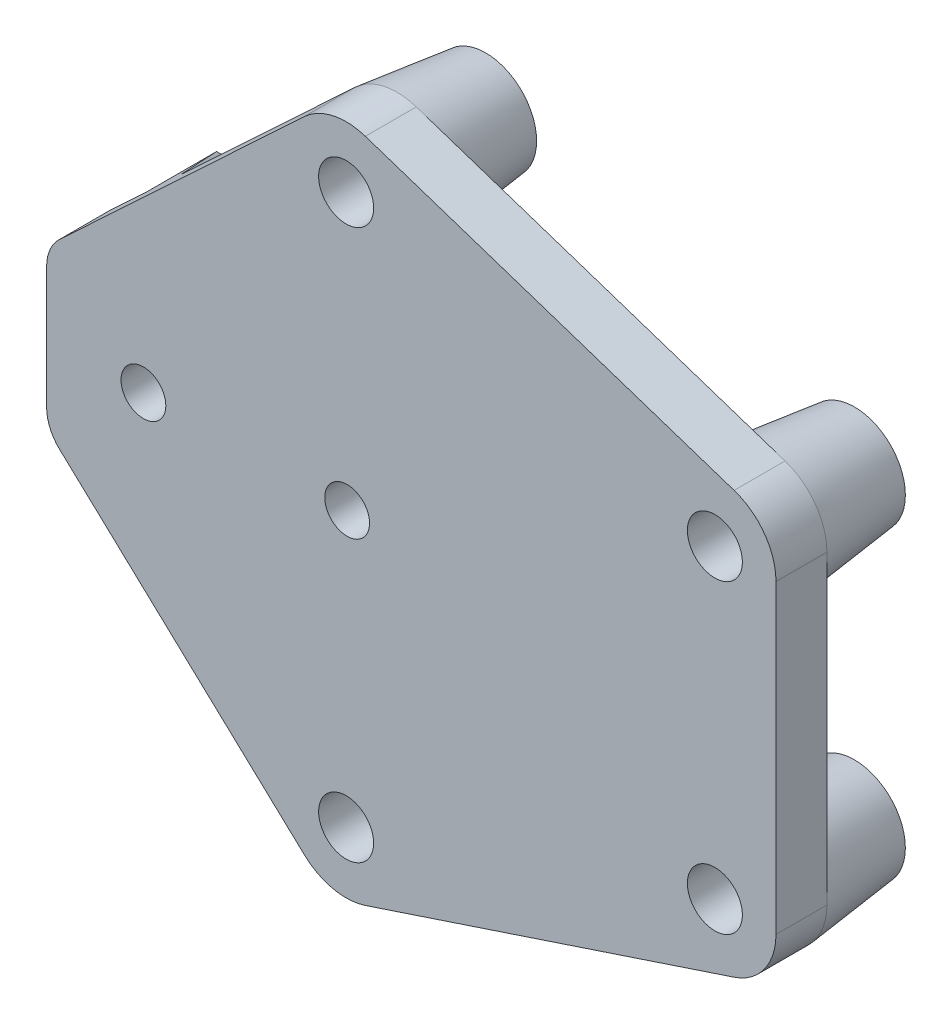
ISO-10303-21;
HEADER;
FILE_DESCRIPTION(('STEP AP214'),'2;1');
FILE_NAME('part.step','',(''),(''),'','','');
FILE_SCHEMA(('AUTOMOTIVE_DESIGN { 1 0 10303 214 1 1 1 1 }'));
ENDSEC;
DATA;
#1=APPLICATION_CONTEXT('core data for automotive mechanical design processes');
#2=APPLICATION_PROTOCOL_DEFINITION('international standard','automotive_design',2000,#1);
#3=PRODUCT_CONTEXT('',#1,'mechanical');
#4=PRODUCT('Part','Part','',(#3));
#5=PRODUCT_RELATED_PRODUCT_CATEGORY('part','',(#4));
#6=PRODUCT_DEFINITION_FORMATION('','',#4);
#7=PRODUCT_DEFINITION_CONTEXT('part definition',#1,'design');
#8=PRODUCT_DEFINITION('design','',#6,#7);
#9=PRODUCT_DEFINITION_SHAPE('','',#8);
#10=(LENGTH_UNIT() NAMED_UNIT(*) SI_UNIT(.MILLI.,.METRE.));
#11=(NAMED_UNIT(*) PLANE_ANGLE_UNIT() SI_UNIT($,.RADIAN.));
#12=(NAMED_UNIT(*) SI_UNIT($,.STERADIAN.) SOLID_ANGLE_UNIT());
#13=UNCERTAINTY_MEASURE_WITH_UNIT(LENGTH_MEASURE(1.E-05),#10,'distance_accuracy_value','');
#14=(GEOMETRIC_REPRESENTATION_CONTEXT(3) GLOBAL_UNCERTAINTY_ASSIGNED_CONTEXT((#13)) GLOBAL_UNIT_ASSIGNED_CONTEXT((#10,
#11,#12)) REPRESENTATION_CONTEXT('',''));
#15=CARTESIAN_POINT('',(0.,0.,0.));
#16=DIRECTION('',(0.,0.,1.));
#17=DIRECTION('',(1.,0.,0.));
#18=AXIS2_PLACEMENT_3D('',#15,#16,#17);
#19=CARTESIAN_POINT('',(0.,0.,0.));
#20=DIRECTION('',(0.,0.,1.));
#21=DIRECTION('',(1.,0.,0.));
#22=AXIS2_PLACEMENT_3D('',#19,#20,#21);
#23=PLANE('',#22);
#24=CARTESIAN_POINT('',(-38.,0.,0.));
#25=DIRECTION('',(0.,0.,1.));
#26=DIRECTION('',(1.,0.,0.));
#27=AXIS2_PLACEMENT_3D('',#24,#25,#26);
#28=CIRCLE('',#27,2.2);
#29=CARTESIAN_POINT('',(-35.8,0.,0.));
#30=VERTEX_POINT('',#29);
#31=EDGE_CURVE('E269',#30,#30,#28,.T.);
#32=ORIENTED_EDGE('',*,*,#31,.T.);
#33=EDGE_LOOP('',(#32));
#34=FACE_BOUND('',#33,.T.);
#35=CARTESIAN_POINT('',(-18.,0.,0.));
#36=DIRECTION('',(0.,0.,1.));
#37=DIRECTION('',(1.,0.,0.));
#38=AXIS2_PLACEMENT_3D('',#35,#36,#37);
#39=CIRCLE('',#38,2.2);
#40=CARTESIAN_POINT('',(-15.8,0.,0.));
#41=VERTEX_POINT('',#40);
#42=EDGE_CURVE('E343',#41,#41,#39,.T.);
#43=ORIENTED_EDGE('',*,*,#42,.T.);
#44=EDGE_LOOP('',(#43));
#45=FACE_BOUND('',#44,.T.);
#46=DIRECTION('',(-0.730613804474262,0.68279094070707,0.));
#47=VECTOR('',#46,1.);
#48=CARTESIAN_POINT('',(-26.0041535728882,-27.8254915836262,0.));
#49=LINE('',#48,#47);
#50=CARTESIAN_POINT('',(-22.1967456442424,-31.3836828268456,0.));
#51=VERTEX_POINT('',#50);
#52=CARTESIAN_POINT('',(-39.4069340042553,-15.3,0.));
#53=VERTEX_POINT('',#52);
#54=EDGE_CURVE('E318',#51,#53,#49,.T.);
#55=ORIENTED_EDGE('',*,*,#54,.T.);
#56=DIRECTION('',(1.,0.,0.));
#57=VECTOR('',#56,1.);
#58=CARTESIAN_POINT('',(-13.,-15.3,0.));
#59=LINE('',#58,#57);
#60=CARTESIAN_POINT('',(-13.,-15.3,0.));
#61=VERTEX_POINT('',#60);
#62=EDGE_CURVE('E182',#53,#61,#59,.T.);
#63=ORIENTED_EDGE('',*,*,#62,.T.);
#64=DIRECTION('',(0.,1.,0.));
#65=VECTOR('',#64,1.);
#66=CARTESIAN_POINT('',(-13.,0.,0.));
#67=LINE('',#66,#65);
#68=CARTESIAN_POINT('',(-13.,-10.3,0.));
#69=VERTEX_POINT('',#68);
#70=EDGE_CURVE('E51',#61,#69,#67,.T.);
#71=ORIENTED_EDGE('',*,*,#70,.T.);
#72=DIRECTION('',(1.,0.,0.));
#73=VECTOR('',#72,1.);
#74=CARTESIAN_POINT('',(0.,-10.3,0.));
#75=LINE('',#74,#73);
#76=CARTESIAN_POINT('',(-42.6170548227199,-10.3,0.));
#77=VERTEX_POINT('',#76);
#78=EDGE_CURVE('E208',#77,#69,#75,.T.);
#79=ORIENTED_EDGE('',*,*,#78,.F.);
#80=DIRECTION('',(0.,1.,0.));
#81=VECTOR('',#80,1.);
#82=CARTESIAN_POINT('',(-42.6170548227199,0.,0.));
#83=LINE('',#82,#81);
#84=CARTESIAN_POINT('',(-42.6170548227199,-12.3,0.));
#85=VERTEX_POINT('',#84);
#86=EDGE_CURVE('E211',#85,#77,#83,.T.);
#87=ORIENTED_EDGE('',*,*,#86,.F.);
#88=CARTESIAN_POINT('',(-46.2311637628283,-8.92245521789705,0.));
#89=VERTEX_POINT('',#88);
#90=EDGE_CURVE('E190',#85,#89,#49,.T.);
#91=ORIENTED_EDGE('',*,*,#90,.T.);
#92=CARTESIAN_POINT('',(-43.5,-6.,0.));
#93=DIRECTION('',(0.,0.,1.));
#94=DIRECTION('',(1.,0.,0.));
#95=AXIS2_PLACEMENT_3D('',#92,#93,#94);
#96=CIRCLE('',#95,4.);
#97=CARTESIAN_POINT('',(-47.5,-6.,0.));
#98=VERTEX_POINT('',#97);
#99=EDGE_CURVE('E265',#98,#89,#96,.T.);
#100=ORIENTED_EDGE('',*,*,#99,.F.);
#101=DIRECTION('',(0.,-1.,0.));
#102=VECTOR('',#101,1.);
#103=CARTESIAN_POINT('',(-47.5,0.,0.));
#104=LINE('',#103,#102);
#105=CARTESIAN_POINT('',(-47.5,6.,0.));
#106=VERTEX_POINT('',#105);
#107=EDGE_CURVE('E341',#106,#98,#104,.T.);
#108=ORIENTED_EDGE('',*,*,#107,.F.);
#109=CARTESIAN_POINT('',(-43.5,6.,0.));
#110=DIRECTION('',(0.,0.,1.));
#111=DIRECTION('',(1.,0.,0.));
#112=AXIS2_PLACEMENT_3D('',#109,#110,#111);
#113=CIRCLE('',#112,3.99999999999999);
#114=CARTESIAN_POINT('',(-46.2311637628283,8.92245521789705,0.));
#115=VERTEX_POINT('',#114);
#116=EDGE_CURVE('E338',#106,#115,#113,.F.);
#117=ORIENTED_EDGE('',*,*,#116,.T.);
#118=DIRECTION('',(-0.730613804474262,-0.68279094070707,0.));
#119=VECTOR('',#118,1.);
#120=CARTESIAN_POINT('',(-26.0041535728882,27.8254915836262,0.));
#121=LINE('',#120,#119);
#122=CARTESIAN_POINT('',(-42.6170548227199,12.3,0.));
#123=VERTEX_POINT('',#122);
#124=EDGE_CURVE('E333',#123,#115,#121,.T.);
#125=ORIENTED_EDGE('',*,*,#124,.F.);
#126=DIRECTION('',(0.,-1.,0.));
#127=VECTOR('',#126,1.);
#128=CARTESIAN_POINT('',(-42.6170548227199,0.,0.));
#129=LINE('',#128,#127);
#130=CARTESIAN_POINT('',(-42.6170548227199,10.3,0.));
#131=VERTEX_POINT('',#130);
#132=EDGE_CURVE('E216',#123,#131,#129,.T.);
#133=ORIENTED_EDGE('',*,*,#132,.T.);
#134=DIRECTION('',(1.,0.,0.));
#135=VECTOR('',#134,1.);
#136=CARTESIAN_POINT('',(0.,10.3,0.));
#137=LINE('',#136,#135);
#138=CARTESIAN_POINT('',(-13.,10.3,0.));
#139=VERTEX_POINT('',#138);
#140=EDGE_CURVE('E233',#131,#139,#137,.T.);
#141=ORIENTED_EDGE('',*,*,#140,.T.);
#142=DIRECTION('',(0.,-1.,0.));
#143=VECTOR('',#142,1.);
#144=CARTESIAN_POINT('',(-13.,0.,0.));
#145=LINE('',#144,#143);
#146=CARTESIAN_POINT('',(-13.,15.3,0.));
#147=VERTEX_POINT('',#146);
#148=EDGE_CURVE('E222',#147,#139,#145,.T.);
#149=ORIENTED_EDGE('',*,*,#148,.F.);
#150=DIRECTION('',(-1.,0.,0.));
#151=VECTOR('',#150,1.);
#152=CARTESIAN_POINT('',(-42.6170548227199,15.3,0.));
#153=LINE('',#152,#151);
#154=CARTESIAN_POINT('',(-39.4069340042553,15.3,0.));
#155=VERTEX_POINT('',#154);
#156=EDGE_CURVE('E411',#147,#155,#153,.T.);
#157=ORIENTED_EDGE('',*,*,#156,.T.);
#158=CARTESIAN_POINT('',(-22.1967456442424,31.3836828268456,0.));
#159=VERTEX_POINT('',#158);
#160=EDGE_CURVE('E335',#159,#155,#121,.T.);
#161=ORIENTED_EDGE('',*,*,#160,.F.);
#162=CARTESIAN_POINT('',(-18.1,27.,0.));
#163=DIRECTION('',(0.,0.,1.));
#164=DIRECTION('',(1.,0.,0.));
#165=AXIS2_PLACEMENT_3D('',#162,#163,#164);
#166=CIRCLE('',#165,5.99999999999999);
#167=CARTESIAN_POINT('',(-16.212075634795,32.6952385017018,0.));
#168=VERTEX_POINT('',#167);
#169=EDGE_CURVE('E381',#159,#168,#166,.T.);
#170=ORIENTED_EDGE('',*,*,#169,.T.);
#171=DIRECTION('',(0.949206416950283,-0.314654060867497,0.));
#172=VECTOR('',#171,1.);
#173=CARTESIAN_POINT('',(8.16002909279774,24.6160877632732,0.));
#174=LINE('',#173,#172);
#175=CARTESIAN_POINT('',(19.987924365205,20.6952385017017,0.));
#176=VERTEX_POINT('',#175);
#177=EDGE_CURVE('E334',#168,#176,#174,.T.);
#178=ORIENTED_EDGE('',*,*,#177,.T.);
#179=CARTESIAN_POINT('',(18.1,15.,0.));
#180=DIRECTION('',(0.,0.,1.));
#181=DIRECTION('',(1.,0.,0.));
#182=AXIS2_PLACEMENT_3D('',#179,#180,#181);
#183=CIRCLE('',#182,6.);
#184=CARTESIAN_POINT('',(24.1000000000001,15.,0.));
#185=VERTEX_POINT('',#184);
#186=EDGE_CURVE('E376',#176,#185,#183,.T.);
#187=ORIENTED_EDGE('',*,*,#186,.T.);
#188=DIRECTION('',(0.,-1.,0.));
#189=VECTOR('',#188,1.);
#190=CARTESIAN_POINT('',(24.1000000000001,0.,0.));
#191=LINE('',#190,#189);
#192=CARTESIAN_POINT('',(24.1000000000001,-15.,0.));
#193=VERTEX_POINT('',#192);
#194=EDGE_CURVE('E329',#185,#193,#191,.T.);
#195=ORIENTED_EDGE('',*,*,#194,.T.);
#196=CARTESIAN_POINT('',(18.1,-15.,0.));
#197=DIRECTION('',(0.,0.,1.));
#198=DIRECTION('',(1.,0.,0.));
#199=AXIS2_PLACEMENT_3D('',#196,#197,#198);
#200=CIRCLE('',#199,6.);
#201=CARTESIAN_POINT('',(19.987924365205,-20.6952385017017,0.));
#202=VERTEX_POINT('',#201);
#203=EDGE_CURVE('E405',#193,#202,#200,.T.);
#204=ORIENTED_EDGE('',*,*,#203,.T.);
#205=DIRECTION('',(-0.949206416950283,-0.314654060867497,0.));
#206=VECTOR('',#205,1.);
#207=CARTESIAN_POINT('',(8.16002909279775,-24.6160877632732,0.));
#208=LINE('',#207,#206);
#209=CARTESIAN_POINT('',(-16.212075634795,-32.6952385017017,0.));
#210=VERTEX_POINT('',#209);
#211=EDGE_CURVE('E323',#202,#210,#208,.T.);
#212=ORIENTED_EDGE('',*,*,#211,.T.);
#213=CARTESIAN_POINT('',(-18.1,-27.,0.));
#214=DIRECTION('',(0.,0.,1.));
#215=DIRECTION('',(1.,0.,0.));
#216=AXIS2_PLACEMENT_3D('',#213,#214,#215);
#217=CIRCLE('',#216,5.99999999999999);
#218=EDGE_CURVE('E408',#210,#51,#217,.T.);
#219=ORIENTED_EDGE('',*,*,#218,.T.);
#220=EDGE_LOOP('',(#55,#63,#71,#79,#87,#91,#100,#108,#117,#125,#133,#141,#149,#157,#161,#170,
#178,#187,#195,#204,#212,#219));
#221=FACE_BOUND('',#220,.T.);
#222=ADVANCED_FACE('F35',(#34,#45,#221),#23,.F.);
#223=CARTESIAN_POINT('',(-43.5,-6.,5.));
#224=DIRECTION('',(0.,0.,-1.));
#225=DIRECTION('',(-1.,0.,0.));
#226=AXIS2_PLACEMENT_3D('',#223,#224,#225);
#227=CYLINDRICAL_SURFACE('',#226,4.);
#228=ORIENTED_EDGE('',*,*,#99,.T.);
#229=DIRECTION('',(0.,0.,-1.));
#230=VECTOR('',#229,1.);
#231=CARTESIAN_POINT('',(-46.2311637628283,-8.92245521789705,5.));
#232=LINE('',#231,#230);
#233=CARTESIAN_POINT('',(-46.2311637628283,-8.92245521789705,5.));
#234=VERTEX_POINT('',#233);
#235=EDGE_CURVE('E374',#234,#89,#232,.T.);
#236=ORIENTED_EDGE('',*,*,#235,.F.);
#237=CARTESIAN_POINT('',(-43.5,-6.,5.));
#238=DIRECTION('',(0.,0.,1.));
#239=DIRECTION('',(1.,0.,0.));
#240=AXIS2_PLACEMENT_3D('',#237,#238,#239);
#241=CIRCLE('',#240,4.);
#242=CARTESIAN_POINT('',(-47.5,-6.,5.));
#243=VERTEX_POINT('',#242);
#244=EDGE_CURVE('E266',#243,#234,#241,.T.);
#245=ORIENTED_EDGE('',*,*,#244,.F.);
#246=DIRECTION('',(0.,0.,-1.));
#247=VECTOR('',#246,1.);
#248=CARTESIAN_POINT('',(-47.5,-6.,5.));
#249=LINE('',#248,#247);
#250=EDGE_CURVE('E315',#243,#98,#249,.T.);
#251=ORIENTED_EDGE('',*,*,#250,.T.);
#252=EDGE_LOOP('',(#228,#236,#245,#251));
#253=FACE_BOUND('',#252,.T.);
#254=ADVANCED_FACE('F442',(#253),#227,.T.);
#255=CARTESIAN_POINT('',(-26.0041535728882,-27.8254915836262,5.));
#256=DIRECTION('',(-0.68279094070707,-0.730613804474262,0.));
#257=DIRECTION('',(0.730613804474262,-0.68279094070707,0.));
#258=AXIS2_PLACEMENT_3D('',#255,#256,#257);
#259=PLANE('',#258);
#260=ORIENTED_EDGE('',*,*,#54,.F.);
#261=DIRECTION('',(0.,0.,-1.));
#262=VECTOR('',#261,1.);
#263=CARTESIAN_POINT('',(-22.1967456442424,-31.3836828268456,5.));
#264=LINE('',#263,#262);
#265=CARTESIAN_POINT('',(-22.1967456442424,-31.3836828268456,5.));
#266=VERTEX_POINT('',#265);
#267=EDGE_CURVE('E371',#266,#51,#264,.T.);
#268=ORIENTED_EDGE('',*,*,#267,.F.);
#269=DIRECTION('',(-0.730613804474262,0.68279094070707,0.));
#270=VECTOR('',#269,1.);
#271=CARTESIAN_POINT('',(-26.0041535728882,-27.8254915836262,5.));
#272=LINE('',#271,#270);
#273=EDGE_CURVE('E268',#266,#234,#272,.T.);
#274=ORIENTED_EDGE('',*,*,#273,.T.);
#275=ORIENTED_EDGE('',*,*,#235,.T.);
#276=ORIENTED_EDGE('',*,*,#90,.F.);
#277=DIRECTION('',(0.,0.,-1.));
#278=VECTOR('',#277,1.);
#279=CARTESIAN_POINT('',(-42.6170548227199,-12.3,-6.8));
#280=LINE('',#279,#278);
#281=CARTESIAN_POINT('',(-42.6170548227199,-12.3,-6.79999999999995));
#282=VERTEX_POINT('',#281);
#283=EDGE_CURVE('E11',#85,#282,#280,.T.);
#284=ORIENTED_EDGE('',*,*,#283,.T.);
#285=DIRECTION('',(-0.396508047488004,0.370554321700877,-0.83992312918865));
#286=VECTOR('',#285,1.);
#287=CARTESIAN_POINT('',(-35.9168597754385,-18.5616288540375,7.39302540248488));
#288=LINE('',#287,#286);
#289=EDGE_CURVE('E179',#282,#53,#288,.F.);
#290=ORIENTED_EDGE('',*,*,#289,.T.);
#291=EDGE_LOOP('',(#260,#268,#274,#275,#276,#284,#290));
#292=FACE_BOUND('',#291,.T.);
#293=ADVANCED_FACE('F188',(#292),#259,.T.);
#294=CARTESIAN_POINT('',(-18.1,-27.,5.));
#295=DIRECTION('',(0.,0.,-1.));
#296=DIRECTION('',(-1.,0.,0.));
#297=AXIS2_PLACEMENT_3D('',#294,#295,#296);
#298=CYLINDRICAL_SURFACE('',#297,6.);
#299=CARTESIAN_POINT('',(-18.1,-27.,0.));
#300=DIRECTION('',(0.,0.,1.));
#301=DIRECTION('',(1.,0.,0.));
#302=AXIS2_PLACEMENT_3D('',#299,#300,#301);
#303=CIRCLE('',#302,6.);
#304=EDGE_CURVE('E320',#51,#210,#303,.T.);
#305=ORIENTED_EDGE('',*,*,#304,.T.);
#306=DIRECTION('',(0.,0.,-1.));
#307=VECTOR('',#306,1.);
#308=CARTESIAN_POINT('',(-16.212075634795,-32.6952385017017,5.));
#309=LINE('',#308,#307);
#310=CARTESIAN_POINT('',(-16.212075634795,-32.6952385017017,5.));
#311=VERTEX_POINT('',#310);
#312=EDGE_CURVE('E368',#311,#210,#309,.T.);
#313=ORIENTED_EDGE('',*,*,#312,.F.);
#314=CARTESIAN_POINT('',(-18.1,-27.,5.));
#315=DIRECTION('',(0.,0.,1.));
#316=DIRECTION('',(1.,0.,0.));
#317=AXIS2_PLACEMENT_3D('',#314,#315,#316);
#318=CIRCLE('',#317,6.);
#319=EDGE_CURVE('E272',#266,#311,#318,.T.);
#320=ORIENTED_EDGE('',*,*,#319,.F.);
#321=ORIENTED_EDGE('',*,*,#267,.T.);
#322=EDGE_LOOP('',(#305,#313,#320,#321));
#323=FACE_BOUND('',#322,.T.);
#324=ADVANCED_FACE('F431',(#323),#298,.T.);
#325=CARTESIAN_POINT('',(8.16002909279775,-24.6160877632732,5.));
#326=DIRECTION('',(0.314654060867497,-0.949206416950283,0.));
#327=DIRECTION('',(0.949206416950283,0.314654060867497,0.));
#328=AXIS2_PLACEMENT_3D('',#325,#326,#327);
#329=PLANE('',#328);
#330=ORIENTED_EDGE('',*,*,#211,.F.);
#331=DIRECTION('',(0.,0.,-1.));
#332=VECTOR('',#331,1.);
#333=CARTESIAN_POINT('',(19.987924365205,-20.6952385017018,5.));
#334=LINE('',#333,#332);
#335=CARTESIAN_POINT('',(19.987924365205,-20.6952385017018,5.));
#336=VERTEX_POINT('',#335);
#337=EDGE_CURVE('E364',#336,#202,#334,.T.);
#338=ORIENTED_EDGE('',*,*,#337,.F.);
#339=DIRECTION('',(-0.949206416950283,-0.314654060867497,0.));
#340=VECTOR('',#339,1.);
#341=CARTESIAN_POINT('',(8.16002909279775,-24.6160877632732,5.));
#342=LINE('',#341,#340);
#343=EDGE_CURVE('E274',#336,#311,#342,.T.);
#344=ORIENTED_EDGE('',*,*,#343,.T.);
#345=ORIENTED_EDGE('',*,*,#312,.T.);
#346=EDGE_LOOP('',(#330,#338,#344,#345));
#347=FACE_BOUND('',#346,.T.);
#348=ADVANCED_FACE('F544',(#347),#329,.T.);
#349=CARTESIAN_POINT('',(18.1,-15.,5.));
#350=DIRECTION('',(0.,0.,-1.));
#351=DIRECTION('',(-1.,0.,0.));
#352=AXIS2_PLACEMENT_3D('',#349,#350,#351);
#353=CYLINDRICAL_SURFACE('',#352,6.00000000000006);
#354=CARTESIAN_POINT('',(18.1,-15.,0.));
#355=DIRECTION('',(0.,0.,1.));
#356=DIRECTION('',(1.,0.,0.));
#357=AXIS2_PLACEMENT_3D('',#354,#355,#356);
#358=CIRCLE('',#357,6.00000000000006);
#359=EDGE_CURVE('E326',#193,#202,#358,.F.);
#360=ORIENTED_EDGE('',*,*,#359,.F.);
#361=DIRECTION('',(0.,0.,-1.));
#362=VECTOR('',#361,1.);
#363=CARTESIAN_POINT('',(24.1000000000001,-15.,5.));
#364=LINE('',#363,#362);
#365=CARTESIAN_POINT('',(24.1000000000001,-15.,5.));
#366=VERTEX_POINT('',#365);
#367=EDGE_CURVE('E362',#366,#193,#364,.T.);
#368=ORIENTED_EDGE('',*,*,#367,.F.);
#369=CARTESIAN_POINT('',(18.1,-15.,5.));
#370=DIRECTION('',(0.,0.,1.));
#371=DIRECTION('',(1.,0.,0.));
#372=AXIS2_PLACEMENT_3D('',#369,#370,#371);
#373=CIRCLE('',#372,6.00000000000006);
#374=EDGE_CURVE('E277',#366,#336,#373,.F.);
#375=ORIENTED_EDGE('',*,*,#374,.T.);
#376=ORIENTED_EDGE('',*,*,#337,.T.);
#377=EDGE_LOOP('',(#360,#368,#375,#376));
#378=FACE_BOUND('',#377,.T.);
#379=ADVANCED_FACE('F540',(#378),#353,.T.);
#380=CARTESIAN_POINT('',(24.1000000000001,0.,5.));
#381=DIRECTION('',(1.,0.,0.));
#382=DIRECTION('',(0.,0.,-1.));
#383=AXIS2_PLACEMENT_3D('',#380,#381,#382);
#384=PLANE('',#383);
#385=ORIENTED_EDGE('',*,*,#194,.F.);
#386=DIRECTION('',(0.,0.,-1.));
#387=VECTOR('',#386,1.);
#388=CARTESIAN_POINT('',(24.1000000000001,15.,5.));
#389=LINE('',#388,#387);
#390=CARTESIAN_POINT('',(24.1000000000001,15.,5.));
#391=VERTEX_POINT('',#390);
#392=EDGE_CURVE('E365',#391,#185,#389,.T.);
#393=ORIENTED_EDGE('',*,*,#392,.F.);
#394=DIRECTION('',(0.,-1.,0.));
#395=VECTOR('',#394,1.);
#396=CARTESIAN_POINT('',(24.1000000000001,0.,5.));
#397=LINE('',#396,#395);
#398=EDGE_CURVE('E280',#391,#366,#397,.T.);
#399=ORIENTED_EDGE('',*,*,#398,.T.);
#400=ORIENTED_EDGE('',*,*,#367,.T.);
#401=EDGE_LOOP('',(#385,#393,#399,#400));
#402=FACE_BOUND('',#401,.T.);
#403=ADVANCED_FACE('F536',(#402),#384,.T.);
#404=CARTESIAN_POINT('',(18.1,15.,5.));
#405=DIRECTION('',(0.,0.,-1.));
#406=DIRECTION('',(-1.,0.,0.));
#407=AXIS2_PLACEMENT_3D('',#404,#405,#406);
#408=CYLINDRICAL_SURFACE('',#407,6.00000000000006);
#409=CARTESIAN_POINT('',(18.1,15.,0.));
#410=DIRECTION('',(0.,0.,1.));
#411=DIRECTION('',(1.,0.,0.));
#412=AXIS2_PLACEMENT_3D('',#409,#410,#411);
#413=CIRCLE('',#412,6.00000000000006);
#414=EDGE_CURVE('E386',#185,#176,#413,.T.);
#415=ORIENTED_EDGE('',*,*,#414,.T.);
#416=DIRECTION('',(0.,0.,-1.));
#417=VECTOR('',#416,1.);
#418=CARTESIAN_POINT('',(19.987924365205,20.6952385017018,5.));
#419=LINE('',#418,#417);
#420=CARTESIAN_POINT('',(19.987924365205,20.6952385017018,5.));
#421=VERTEX_POINT('',#420);
#422=EDGE_CURVE('E361',#421,#176,#419,.T.);
#423=ORIENTED_EDGE('',*,*,#422,.F.);
#424=CARTESIAN_POINT('',(18.1,15.,5.));
#425=DIRECTION('',(0.,0.,1.));
#426=DIRECTION('',(1.,0.,0.));
#427=AXIS2_PLACEMENT_3D('',#424,#425,#426);
#428=CIRCLE('',#427,6.00000000000006);
#429=EDGE_CURVE('E283',#391,#421,#428,.T.);
#430=ORIENTED_EDGE('',*,*,#429,.F.);
#431=ORIENTED_EDGE('',*,*,#392,.T.);
#432=EDGE_LOOP('',(#415,#423,#430,#431));
#433=FACE_BOUND('',#432,.T.);
#434=ADVANCED_FACE('F532',(#433),#408,.T.);
#435=CARTESIAN_POINT('',(8.16002909279774,24.6160877632732,5.));
#436=DIRECTION('',(0.314654060867497,0.949206416950283,0.));
#437=DIRECTION('',(-0.949206416950283,0.314654060867497,0.));
#438=AXIS2_PLACEMENT_3D('',#435,#436,#437);
#439=PLANE('',#438);
#440=ORIENTED_EDGE('',*,*,#177,.F.);
#441=DIRECTION('',(0.,0.,-1.));
#442=VECTOR('',#441,1.);
#443=CARTESIAN_POINT('',(-16.212075634795,32.6952385017018,5.));
#444=LINE('',#443,#442);
#445=CARTESIAN_POINT('',(-16.212075634795,32.6952385017018,5.));
#446=VERTEX_POINT('',#445);
#447=EDGE_CURVE('E358',#446,#168,#444,.T.);
#448=ORIENTED_EDGE('',*,*,#447,.F.);
#449=DIRECTION('',(0.949206416950283,-0.314654060867497,0.));
#450=VECTOR('',#449,1.);
#451=CARTESIAN_POINT('',(8.16002909279774,24.6160877632732,5.));
#452=LINE('',#451,#450);
#453=EDGE_CURVE('E285',#446,#421,#452,.T.);
#454=ORIENTED_EDGE('',*,*,#453,.T.);
#455=ORIENTED_EDGE('',*,*,#422,.T.);
#456=EDGE_LOOP('',(#440,#448,#454,#455));
#457=FACE_BOUND('',#456,.T.);
#458=ADVANCED_FACE('F528',(#457),#439,.T.);
#459=CARTESIAN_POINT('',(-18.1,27.,5.));
#460=DIRECTION('',(0.,0.,-1.));
#461=DIRECTION('',(-1.,0.,0.));
#462=AXIS2_PLACEMENT_3D('',#459,#460,#461);
#463=CYLINDRICAL_SURFACE('',#462,6.00000000000006);
#464=CARTESIAN_POINT('',(-18.1,27.,0.));
#465=DIRECTION('',(0.,0.,1.));
#466=DIRECTION('',(1.,0.,0.));
#467=AXIS2_PLACEMENT_3D('',#464,#465,#466);
#468=CIRCLE('',#467,6.00000000000006);
#469=EDGE_CURVE('E330',#168,#159,#468,.T.);
#470=ORIENTED_EDGE('',*,*,#469,.T.);
#471=DIRECTION('',(0.,0.,-1.));
#472=VECTOR('',#471,1.);
#473=CARTESIAN_POINT('',(-22.1967456442425,31.3836828268456,5.));
#474=LINE('',#473,#472);
#475=CARTESIAN_POINT('',(-22.1967456442425,31.3836828268456,5.));
#476=VERTEX_POINT('',#475);
#477=EDGE_CURVE('E355',#476,#159,#474,.T.);
#478=ORIENTED_EDGE('',*,*,#477,.F.);
#479=CARTESIAN_POINT('',(-18.1,27.,5.));
#480=DIRECTION('',(0.,0.,1.));
#481=DIRECTION('',(1.,0.,0.));
#482=AXIS2_PLACEMENT_3D('',#479,#480,#481);
#483=CIRCLE('',#482,6.00000000000006);
#484=EDGE_CURVE('E288',#446,#476,#483,.T.);
#485=ORIENTED_EDGE('',*,*,#484,.F.);
#486=ORIENTED_EDGE('',*,*,#447,.T.);
#487=EDGE_LOOP('',(#470,#478,#485,#486));
#488=FACE_BOUND('',#487,.T.);
#489=ADVANCED_FACE('F525',(#488),#463,.T.);
#490=CARTESIAN_POINT('',(-26.0041535728882,27.8254915836262,5.));
#491=DIRECTION('',(0.68279094070707,-0.730613804474262,0.));
#492=DIRECTION('',(0.730613804474262,0.68279094070707,0.));
#493=AXIS2_PLACEMENT_3D('',#490,#491,#492);
#494=PLANE('',#493);
#495=ORIENTED_EDGE('',*,*,#160,.T.);
#496=DIRECTION('',(0.396508047488004,0.370554321700877,0.83992312918865));
#497=VECTOR('',#496,1.);
#498=CARTESIAN_POINT('',(-33.7942432497082,20.5453079543888,11.8893646966145));
#499=LINE('',#498,#497);
#500=CARTESIAN_POINT('',(-42.6170548227199,12.3,-6.8));
#501=VERTEX_POINT('',#500);
#502=EDGE_CURVE('E416',#155,#501,#499,.F.);
#503=ORIENTED_EDGE('',*,*,#502,.T.);
#504=DIRECTION('',(0.,0.,-1.));
#505=VECTOR('',#504,1.);
#506=CARTESIAN_POINT('',(-42.6170548227199,12.3,5.));
#507=LINE('',#506,#505);
#508=EDGE_CURVE('E419',#123,#501,#507,.T.);
#509=ORIENTED_EDGE('',*,*,#508,.F.);
#510=ORIENTED_EDGE('',*,*,#124,.T.);
#511=DIRECTION('',(0.,0.,-1.));
#512=VECTOR('',#511,1.);
#513=CARTESIAN_POINT('',(-46.2311637628283,8.92245521789705,5.));
#514=LINE('',#513,#512);
#515=CARTESIAN_POINT('',(-46.2311637628283,8.92245521789705,5.));
#516=VERTEX_POINT('',#515);
#517=EDGE_CURVE('E352',#516,#115,#514,.T.);
#518=ORIENTED_EDGE('',*,*,#517,.F.);
#519=DIRECTION('',(-0.730613804474262,-0.68279094070707,0.));
#520=VECTOR('',#519,1.);
#521=CARTESIAN_POINT('',(-26.0041535728882,27.8254915836262,5.));
#522=LINE('',#521,#520);
#523=EDGE_CURVE('E290',#476,#516,#522,.T.);
#524=ORIENTED_EDGE('',*,*,#523,.F.);
#525=ORIENTED_EDGE('',*,*,#477,.T.);
#526=EDGE_LOOP('',(#495,#503,#509,#510,#518,#524,#525));
#527=FACE_BOUND('',#526,.T.);
#528=ADVANCED_FACE('F453',(#527),#494,.F.);
#529=CARTESIAN_POINT('',(-43.5,6.,5.));
#530=DIRECTION('',(0.,0.,-1.));
#531=DIRECTION('',(-1.,0.,0.));
#532=AXIS2_PLACEMENT_3D('',#529,#530,#531);
#533=CYLINDRICAL_SURFACE('',#532,3.99999999999999);
#534=ORIENTED_EDGE('',*,*,#116,.F.);
#535=DIRECTION('',(0.,0.,-1.));
#536=VECTOR('',#535,1.);
#537=CARTESIAN_POINT('',(-47.5,6.,5.));
#538=LINE('',#537,#536);
#539=CARTESIAN_POINT('',(-47.5,6.,5.));
#540=VERTEX_POINT('',#539);
#541=EDGE_CURVE('E350',#540,#106,#538,.T.);
#542=ORIENTED_EDGE('',*,*,#541,.F.);
#543=CARTESIAN_POINT('',(-43.5,6.,5.));
#544=DIRECTION('',(0.,0.,1.));
#545=DIRECTION('',(1.,0.,0.));
#546=AXIS2_PLACEMENT_3D('',#543,#544,#545);
#547=CIRCLE('',#546,3.99999999999999);
#548=EDGE_CURVE('E292',#540,#516,#547,.F.);
#549=ORIENTED_EDGE('',*,*,#548,.T.);
#550=ORIENTED_EDGE('',*,*,#517,.T.);
#551=EDGE_LOOP('',(#534,#542,#549,#550));
#552=FACE_BOUND('',#551,.T.);
#553=ADVANCED_FACE('F449',(#552),#533,.T.);
#554=CARTESIAN_POINT('',(18.1,-15.,5.));
#555=DIRECTION('',(0.,0.,-1.));
#556=DIRECTION('',(-1.,0.,0.));
#557=AXIS2_PLACEMENT_3D('',#554,#555,#556);
#558=CYLINDRICAL_SURFACE('',#557,2.7);
#559=CARTESIAN_POINT('',(18.1,-15.,5.));
#560=DIRECTION('',(0.,0.,1.));
#561=DIRECTION('',(1.,0.,0.));
#562=AXIS2_PLACEMENT_3D('',#559,#560,#561);
#563=CIRCLE('',#562,2.7);
#564=CARTESIAN_POINT('',(20.8,-15.,5.));
#565=VERTEX_POINT('',#564);
#566=EDGE_CURVE('E309',#565,#565,#563,.F.);
#567=ORIENTED_EDGE('',*,*,#566,.F.);
#568=EDGE_LOOP('',(#567));
#569=FACE_BOUND('',#568,.T.);
#570=CARTESIAN_POINT('',(18.1,-15.,-8.7));
#571=DIRECTION('',(0.,0.,-1.));
#572=DIRECTION('',(1.,0.,0.));
#573=AXIS2_PLACEMENT_3D('',#570,#571,#572);
#574=CIRCLE('',#573,2.7);
#575=CARTESIAN_POINT('',(20.8,-15.,-8.7));
#576=VERTEX_POINT('',#575);
#577=EDGE_CURVE('E250',#576,#576,#574,.T.);
#578=ORIENTED_EDGE('',*,*,#577,.T.);
#579=EDGE_LOOP('',(#578));
#580=FACE_BOUND('',#579,.T.);
#581=ADVANCED_FACE('F499',(#569,#580),#558,.F.);
#582=CARTESIAN_POINT('',(18.1,15.,5.));
#583=DIRECTION('',(0.,0.,-1.));
#584=DIRECTION('',(-1.,0.,0.));
#585=AXIS2_PLACEMENT_3D('',#582,#583,#584);
#586=CYLINDRICAL_SURFACE('',#585,2.7);
#587=CARTESIAN_POINT('',(18.1,15.,5.));
#588=DIRECTION('',(0.,0.,1.));
#589=DIRECTION('',(1.,0.,0.));
#590=AXIS2_PLACEMENT_3D('',#587,#588,#589);
#591=CIRCLE('',#590,2.7);
#592=CARTESIAN_POINT('',(20.8,15.,5.));
#593=VERTEX_POINT('',#592);
#594=EDGE_CURVE('E306',#593,#593,#591,.T.);
#595=ORIENTED_EDGE('',*,*,#594,.T.);
#596=EDGE_LOOP('',(#595));
#597=FACE_BOUND('',#596,.T.);
#598=CARTESIAN_POINT('',(18.1,15.,-8.7));
#599=DIRECTION('',(0.,0.,1.));
#600=DIRECTION('',(1.,0.,0.));
#601=AXIS2_PLACEMENT_3D('',#598,#599,#600);
#602=CIRCLE('',#601,2.7);
#603=CARTESIAN_POINT('',(20.8,15.,-8.7));
#604=VERTEX_POINT('',#603);
#605=EDGE_CURVE('E262',#604,#604,#602,.T.);
#606=ORIENTED_EDGE('',*,*,#605,.F.);
#607=EDGE_LOOP('',(#606));
#608=FACE_BOUND('',#607,.T.);
#609=ADVANCED_FACE('F502',(#597,#608),#586,.F.);
#610=CARTESIAN_POINT('',(-38.,0.,5.));
#611=DIRECTION('',(0.,0.,-1.));
#612=DIRECTION('',(-1.,0.,0.));
#613=AXIS2_PLACEMENT_3D('',#610,#611,#612);
#614=CYLINDRICAL_SURFACE('',#613,2.2);
#615=CARTESIAN_POINT('',(-38.,0.,5.));
#616=DIRECTION('',(0.,0.,1.));
#617=DIRECTION('',(1.,0.,0.));
#618=AXIS2_PLACEMENT_3D('',#615,#616,#617);
#619=CIRCLE('',#618,2.2);
#620=CARTESIAN_POINT('',(-35.8,0.,5.));
#621=VERTEX_POINT('',#620);
#622=EDGE_CURVE('E303',#621,#621,#619,.T.);
#623=ORIENTED_EDGE('',*,*,#622,.T.);
#624=EDGE_LOOP('',(#623));
#625=FACE_BOUND('',#624,.T.);
#626=ORIENTED_EDGE('',*,*,#31,.F.);
#627=EDGE_LOOP('',(#626));
#628=FACE_BOUND('',#627,.T.);
#629=ADVANCED_FACE('F506',(#625,#628),#614,.F.);
#630=CARTESIAN_POINT('',(-18.,0.,5.));
#631=DIRECTION('',(0.,0.,-1.));
#632=DIRECTION('',(-1.,0.,0.));
#633=AXIS2_PLACEMENT_3D('',#630,#631,#632);
#634=CYLINDRICAL_SURFACE('',#633,2.2);
#635=CARTESIAN_POINT('',(-18.,0.,5.));
#636=DIRECTION('',(0.,0.,1.));
#637=DIRECTION('',(1.,0.,0.));
#638=AXIS2_PLACEMENT_3D('',#635,#636,#637);
#639=CIRCLE('',#638,2.2);
#640=CARTESIAN_POINT('',(-15.8,0.,5.));
#641=VERTEX_POINT('',#640);
#642=EDGE_CURVE('E300',#641,#641,#639,.T.);
#643=ORIENTED_EDGE('',*,*,#642,.T.);
#644=EDGE_LOOP('',(#643));
#645=FACE_BOUND('',#644,.T.);
#646=ORIENTED_EDGE('',*,*,#42,.F.);
#647=EDGE_LOOP('',(#646));
#648=FACE_BOUND('',#647,.T.);
#649=ADVANCED_FACE('F510',(#645,#648),#634,.F.);
#650=CARTESIAN_POINT('',(-18.1,27.,5.));
#651=DIRECTION('',(0.,0.,-1.));
#652=DIRECTION('',(-1.,0.,0.));
#653=AXIS2_PLACEMENT_3D('',#650,#651,#652);
#654=CYLINDRICAL_SURFACE('',#653,2.7);
#655=CARTESIAN_POINT('',(-18.1,27.,5.));
#656=DIRECTION('',(0.,0.,1.));
#657=DIRECTION('',(1.,0.,0.));
#658=AXIS2_PLACEMENT_3D('',#655,#656,#657);
#659=CIRCLE('',#658,2.7);
#660=CARTESIAN_POINT('',(-15.4,27.,5.));
#661=VERTEX_POINT('',#660);
#662=EDGE_CURVE('E297',#661,#661,#659,.T.);
#663=ORIENTED_EDGE('',*,*,#662,.T.);
#664=EDGE_LOOP('',(#663));
#665=FACE_BOUND('',#664,.T.);
#666=CARTESIAN_POINT('',(-18.1,27.,-8.7));
#667=DIRECTION('',(0.,0.,1.));
#668=DIRECTION('',(1.,0.,0.));
#669=AXIS2_PLACEMENT_3D('',#666,#667,#668);
#670=CIRCLE('',#669,2.7);
#671=CARTESIAN_POINT('',(-15.4,27.,-8.7));
#672=VERTEX_POINT('',#671);
#673=EDGE_CURVE('E256',#672,#672,#670,.T.);
#674=ORIENTED_EDGE('',*,*,#673,.F.);
#675=EDGE_LOOP('',(#674));
#676=FACE_BOUND('',#675,.T.);
#677=ADVANCED_FACE('F514',(#665,#676),#654,.F.);
#678=CARTESIAN_POINT('',(-47.5,0.,5.));
#679=DIRECTION('',(1.,0.,0.));
#680=DIRECTION('',(0.,1.,0.));
#681=AXIS2_PLACEMENT_3D('',#678,#679,#680);
#682=PLANE('',#681);
#683=ORIENTED_EDGE('',*,*,#107,.T.);
#684=ORIENTED_EDGE('',*,*,#250,.F.);
#685=DIRECTION('',(0.,-1.,0.));
#686=VECTOR('',#685,1.);
#687=CARTESIAN_POINT('',(-47.5,0.,5.));
#688=LINE('',#687,#686);
#689=EDGE_CURVE('E295',#540,#243,#688,.T.);
#690=ORIENTED_EDGE('',*,*,#689,.F.);
#691=ORIENTED_EDGE('',*,*,#541,.T.);
#692=EDGE_LOOP('',(#683,#684,#690,#691));
#693=FACE_BOUND('',#692,.T.);
#694=ADVANCED_FACE('F497',(#693),#682,.F.);
#695=CARTESIAN_POINT('',(-18.1,-27.,5.));
#696=DIRECTION('',(0.,0.,-1.));
#697=DIRECTION('',(-1.,0.,0.));
#698=AXIS2_PLACEMENT_3D('',#695,#696,#697);
#699=CYLINDRICAL_SURFACE('',#698,2.7);
#700=CARTESIAN_POINT('',(-18.1,-27.,5.));
#701=DIRECTION('',(0.,0.,1.));
#702=DIRECTION('',(1.,0.,0.));
#703=AXIS2_PLACEMENT_3D('',#700,#701,#702);
#704=CIRCLE('',#703,2.7);
#705=CARTESIAN_POINT('',(-15.4,-27.,5.));
#706=VERTEX_POINT('',#705);
#707=EDGE_CURVE('E312',#706,#706,#704,.T.);
#708=ORIENTED_EDGE('',*,*,#707,.T.);
#709=EDGE_LOOP('',(#708));
#710=FACE_BOUND('',#709,.T.);
#711=CARTESIAN_POINT('',(-18.1,-27.,-8.7));
#712=DIRECTION('',(0.,0.,-1.));
#713=DIRECTION('',(1.,0.,0.));
#714=AXIS2_PLACEMENT_3D('',#711,#712,#713);
#715=CIRCLE('',#714,2.7);
#716=CARTESIAN_POINT('',(-15.4,-27.,-8.7));
#717=VERTEX_POINT('',#716);
#718=EDGE_CURVE('E244',#717,#717,#715,.T.);
#719=ORIENTED_EDGE('',*,*,#718,.T.);
#720=EDGE_LOOP('',(#719));
#721=FACE_BOUND('',#720,.T.);
#722=ADVANCED_FACE('F494',(#710,#721),#699,.F.);
#723=CARTESIAN_POINT('',(0.,0.,5.));
#724=DIRECTION('',(0.,0.,1.));
#725=DIRECTION('',(1.,0.,0.));
#726=AXIS2_PLACEMENT_3D('',#723,#724,#725);
#727=PLANE('',#726);
#728=ORIENTED_EDGE('',*,*,#244,.T.);
#729=ORIENTED_EDGE('',*,*,#273,.F.);
#730=ORIENTED_EDGE('',*,*,#319,.T.);
#731=ORIENTED_EDGE('',*,*,#343,.F.);
#732=ORIENTED_EDGE('',*,*,#374,.F.);
#733=ORIENTED_EDGE('',*,*,#398,.F.);
#734=ORIENTED_EDGE('',*,*,#429,.T.);
#735=ORIENTED_EDGE('',*,*,#453,.F.);
#736=ORIENTED_EDGE('',*,*,#484,.T.);
#737=ORIENTED_EDGE('',*,*,#523,.T.);
#738=ORIENTED_EDGE('',*,*,#548,.F.);
#739=ORIENTED_EDGE('',*,*,#689,.T.);
#740=EDGE_LOOP('',(#728,#729,#730,#731,#732,#733,#734,#735,#736,#737,#738,#739));
#741=FACE_BOUND('',#740,.T.);
#742=ORIENTED_EDGE('',*,*,#662,.F.);
#743=EDGE_LOOP('',(#742));
#744=FACE_BOUND('',#743,.T.);
#745=ORIENTED_EDGE('',*,*,#642,.F.);
#746=EDGE_LOOP('',(#745));
#747=FACE_BOUND('',#746,.T.);
#748=ORIENTED_EDGE('',*,*,#622,.F.);
#749=EDGE_LOOP('',(#748));
#750=FACE_BOUND('',#749,.T.);
#751=ORIENTED_EDGE('',*,*,#594,.F.);
#752=EDGE_LOOP('',(#751));
#753=FACE_BOUND('',#752,.T.);
#754=ORIENTED_EDGE('',*,*,#566,.T.);
#755=EDGE_LOOP('',(#754));
#756=FACE_BOUND('',#755,.T.);
#757=ORIENTED_EDGE('',*,*,#707,.F.);
#758=EDGE_LOOP('',(#757));
#759=FACE_BOUND('',#758,.T.);
#760=ADVANCED_FACE('F434',(#741,#744,#747,#750,#753,#756,#759),#727,.T.);
#761=CARTESIAN_POINT('',(6.27210472759275,18.9208492615715,-8.7));
#762=DIRECTION('',(0.,0.,-1.));
#763=DIRECTION('',(-1.,0.,0.));
#764=AXIS2_PLACEMENT_3D('',#761,#762,#763);
#765=PLANE('',#764);
#766=ORIENTED_EDGE('',*,*,#605,.T.);
#767=EDGE_LOOP('',(#766));
#768=FACE_BOUND('',#767,.T.);
#769=CARTESIAN_POINT('',(18.1,15.,-8.7));
#770=DIRECTION('',(0.,0.,1.));
#771=DIRECTION('',(1.,0.,0.));
#772=AXIS2_PLACEMENT_3D('',#769,#770,#771);
#773=CIRCLE('',#772,5.);
#774=CARTESIAN_POINT('',(23.1,15.,-8.7));
#775=VERTEX_POINT('',#774);
#776=EDGE_CURVE('E259',#775,#775,#773,.T.);
#777=ORIENTED_EDGE('',*,*,#776,.F.);
#778=EDGE_LOOP('',(#777));
#779=FACE_BOUND('',#778,.T.);
#780=ADVANCED_FACE('F682',(#768,#779),#765,.T.);
#781=CARTESIAN_POINT('',(18.1,15.,0.));
#782=DIRECTION('',(0.,0.,1.));
#783=DIRECTION('',(1.,0.,0.));
#784=AXIS2_PLACEMENT_3D('',#781,#782,#783);
#785=CONICAL_SURFACE('',#784,6.,0.114440305270064);
#786=ORIENTED_EDGE('',*,*,#776,.T.);
#787=EDGE_LOOP('',(#786));
#788=FACE_BOUND('',#787,.T.);
#789=ORIENTED_EDGE('',*,*,#414,.F.);
#790=ORIENTED_EDGE('',*,*,#186,.F.);
#791=EDGE_LOOP('',(#789,#790));
#792=FACE_BOUND('',#791,.T.);
#793=ADVANCED_FACE('F687',(#788,#792),#785,.T.);
#794=CARTESIAN_POINT('',(6.27210472759275,18.9208492615715,-8.7));
#795=DIRECTION('',(0.,0.,-1.));
#796=DIRECTION('',(-1.,0.,0.));
#797=AXIS2_PLACEMENT_3D('',#794,#795,#796);
#798=PLANE('',#797);
#799=ORIENTED_EDGE('',*,*,#673,.T.);
#800=EDGE_LOOP('',(#799));
#801=FACE_BOUND('',#800,.T.);
#802=CARTESIAN_POINT('',(-18.1,27.,-8.7));
#803=DIRECTION('',(0.,0.,1.));
#804=DIRECTION('',(1.,0.,0.));
#805=AXIS2_PLACEMENT_3D('',#802,#803,#804);
#806=CIRCLE('',#805,5.00000000000001);
#807=CARTESIAN_POINT('',(-13.1,27.,-8.7));
#808=VERTEX_POINT('',#807);
#809=EDGE_CURVE('E253',#808,#808,#806,.T.);
#810=ORIENTED_EDGE('',*,*,#809,.F.);
#811=EDGE_LOOP('',(#810));
#812=FACE_BOUND('',#811,.T.);
#813=ADVANCED_FACE('F693',(#801,#812),#798,.T.);
#814=CARTESIAN_POINT('',(-18.1,27.,0.));
#815=DIRECTION('',(0.,0.,1.));
#816=DIRECTION('',(1.,0.,0.));
#817=AXIS2_PLACEMENT_3D('',#814,#815,#816);
#818=CONICAL_SURFACE('',#817,5.99999999999999,0.114440305270062);
#819=ORIENTED_EDGE('',*,*,#809,.T.);
#820=EDGE_LOOP('',(#819));
#821=FACE_BOUND('',#820,.T.);
#822=ORIENTED_EDGE('',*,*,#469,.F.);
#823=ORIENTED_EDGE('',*,*,#169,.F.);
#824=EDGE_LOOP('',(#822,#823));
#825=FACE_BOUND('',#824,.T.);
#826=ADVANCED_FACE('F700',(#821,#825),#818,.T.);
#827=CARTESIAN_POINT('',(6.27210472759275,-18.9208492615715,-8.7));
#828=DIRECTION('',(0.,0.,-1.));
#829=DIRECTION('',(-1.,0.,0.));
#830=AXIS2_PLACEMENT_3D('',#827,#828,#829);
#831=PLANE('',#830);
#832=ORIENTED_EDGE('',*,*,#577,.F.);
#833=EDGE_LOOP('',(#832));
#834=FACE_BOUND('',#833,.T.);
#835=CARTESIAN_POINT('',(18.1,-15.,-8.7));
#836=DIRECTION('',(0.,0.,-1.));
#837=DIRECTION('',(1.,0.,0.));
#838=AXIS2_PLACEMENT_3D('',#835,#836,#837);
#839=CIRCLE('',#838,5.);
#840=CARTESIAN_POINT('',(23.1,-15.,-8.7));
#841=VERTEX_POINT('',#840);
#842=EDGE_CURVE('E247',#841,#841,#839,.T.);
#843=ORIENTED_EDGE('',*,*,#842,.T.);
#844=EDGE_LOOP('',(#843));
#845=FACE_BOUND('',#844,.T.);
#846=ADVANCED_FACE('F707',(#834,#845),#831,.T.);
#847=CARTESIAN_POINT('',(18.1,-15.,0.));
#848=DIRECTION('',(0.,0.,1.));
#849=DIRECTION('',(1.,0.,0.));
#850=AXIS2_PLACEMENT_3D('',#847,#848,#849);
#851=CONICAL_SURFACE('',#850,6.,0.114440305270064);
#852=ORIENTED_EDGE('',*,*,#842,.F.);
#853=EDGE_LOOP('',(#852));
#854=FACE_BOUND('',#853,.T.);
#855=ORIENTED_EDGE('',*,*,#359,.T.);
#856=ORIENTED_EDGE('',*,*,#203,.F.);
#857=EDGE_LOOP('',(#855,#856));
#858=FACE_BOUND('',#857,.T.);
#859=ADVANCED_FACE('F714',(#854,#858),#851,.T.);
#860=CARTESIAN_POINT('',(6.27210472759275,-18.9208492615715,-8.7));
#861=DIRECTION('',(0.,0.,-1.));
#862=DIRECTION('',(-1.,0.,0.));
#863=AXIS2_PLACEMENT_3D('',#860,#861,#862);
#864=PLANE('',#863);
#865=ORIENTED_EDGE('',*,*,#718,.F.);
#866=EDGE_LOOP('',(#865));
#867=FACE_BOUND('',#866,.T.);
#868=CARTESIAN_POINT('',(-18.1,-27.,-8.7));
#869=DIRECTION('',(0.,0.,-1.));
#870=DIRECTION('',(1.,0.,0.));
#871=AXIS2_PLACEMENT_3D('',#868,#869,#870);
#872=CIRCLE('',#871,5.00000000000001);
#873=CARTESIAN_POINT('',(-13.1,-27.,-8.7));
#874=VERTEX_POINT('',#873);
#875=EDGE_CURVE('E240',#874,#874,#872,.T.);
#876=ORIENTED_EDGE('',*,*,#875,.T.);
#877=EDGE_LOOP('',(#876));
#878=FACE_BOUND('',#877,.T.);
#879=ADVANCED_FACE('F722',(#867,#878),#864,.T.);
#880=CARTESIAN_POINT('',(-18.1,-27.,0.));
#881=DIRECTION('',(0.,0.,1.));
#882=DIRECTION('',(1.,0.,0.));
#883=AXIS2_PLACEMENT_3D('',#880,#881,#882);
#884=CONICAL_SURFACE('',#883,5.99999999999999,0.114440305270062);
#885=ORIENTED_EDGE('',*,*,#875,.F.);
#886=EDGE_LOOP('',(#885));
#887=FACE_BOUND('',#886,.T.);
#888=ORIENTED_EDGE('',*,*,#304,.F.);
#889=ORIENTED_EDGE('',*,*,#218,.F.);
#890=EDGE_LOOP('',(#888,#889));
#891=FACE_BOUND('',#890,.T.);
#892=ADVANCED_FACE('F730',(#887,#891),#884,.T.);
#893=CARTESIAN_POINT('',(-42.6170548227199,0.,-6.8));
#894=DIRECTION('',(-1.,0.,0.));
#895=DIRECTION('',(0.,0.,1.));
#896=AXIS2_PLACEMENT_3D('',#893,#894,#895);
#897=PLANE('',#896);
#898=ORIENTED_EDGE('',*,*,#132,.F.);
#899=ORIENTED_EDGE('',*,*,#508,.T.);
#900=DIRECTION('',(0.,-1.,0.));
#901=VECTOR('',#900,1.);
#902=CARTESIAN_POINT('',(-42.6170548227199,0.,-6.8));
#903=LINE('',#902,#901);
#904=CARTESIAN_POINT('',(-42.6170548227199,10.3,-6.8));
#905=VERTEX_POINT('',#904);
#906=EDGE_CURVE('E218',#501,#905,#903,.T.);
#907=ORIENTED_EDGE('',*,*,#906,.T.);
#908=DIRECTION('',(0.,0.,1.));
#909=VECTOR('',#908,1.);
#910=CARTESIAN_POINT('',(-42.6170548227199,10.3,-6.8));
#911=LINE('',#910,#909);
#912=EDGE_CURVE('E230',#905,#131,#911,.T.);
#913=ORIENTED_EDGE('',*,*,#912,.T.);
#914=EDGE_LOOP('',(#898,#899,#907,#913));
#915=FACE_BOUND('',#914,.T.);
#916=ADVANCED_FACE('F457',(#915),#897,.T.);
#917=CARTESIAN_POINT('',(-13.,0.,-6.8));
#918=DIRECTION('',(-1.,0.,0.));
#919=DIRECTION('',(0.,0.,1.));
#920=AXIS2_PLACEMENT_3D('',#917,#918,#919);
#921=PLANE('',#920);
#922=ORIENTED_EDGE('',*,*,#148,.T.);
#923=DIRECTION('',(0.,0.,1.));
#924=VECTOR('',#923,1.);
#925=CARTESIAN_POINT('',(-13.,10.3,-6.8));
#926=LINE('',#925,#924);
#927=CARTESIAN_POINT('',(-13.,10.3,-6.8));
#928=VERTEX_POINT('',#927);
#929=EDGE_CURVE('E237',#928,#139,#926,.T.);
#930=ORIENTED_EDGE('',*,*,#929,.F.);
#931=DIRECTION('',(0.,-1.,0.));
#932=VECTOR('',#931,1.);
#933=CARTESIAN_POINT('',(-13.,0.,-6.8));
#934=LINE('',#933,#932);
#935=CARTESIAN_POINT('',(-13.,12.3,-6.8));
#936=VERTEX_POINT('',#935);
#937=EDGE_CURVE('E225',#936,#928,#934,.T.);
#938=ORIENTED_EDGE('',*,*,#937,.F.);
#939=DIRECTION('',(0.,-0.403640206576296,-0.914917801572931));
#940=VECTOR('',#939,1.);
#941=CARTESIAN_POINT('',(-13.,10.296017378711,-11.3423606082549));
#942=LINE('',#941,#940);
#943=EDGE_CURVE('E413',#936,#147,#942,.F.);
#944=ORIENTED_EDGE('',*,*,#943,.T.);
#945=EDGE_LOOP('',(#922,#930,#938,#944));
#946=FACE_BOUND('',#945,.T.);
#947=ADVANCED_FACE('F465',(#946),#921,.F.);
#948=CARTESIAN_POINT('',(0.,10.3,-6.8));
#949=DIRECTION('',(0.,-1.,0.));
#950=DIRECTION('',(0.,0.,-1.));
#951=AXIS2_PLACEMENT_3D('',#948,#949,#950);
#952=PLANE('',#951);
#953=ORIENTED_EDGE('',*,*,#140,.F.);
#954=ORIENTED_EDGE('',*,*,#912,.F.);
#955=DIRECTION('',(1.,0.,0.));
#956=VECTOR('',#955,1.);
#957=CARTESIAN_POINT('',(0.,10.3,-6.8));
#958=LINE('',#957,#956);
#959=EDGE_CURVE('E221',#905,#928,#958,.T.);
#960=ORIENTED_EDGE('',*,*,#959,.T.);
#961=ORIENTED_EDGE('',*,*,#929,.T.);
#962=EDGE_LOOP('',(#953,#954,#960,#961));
#963=FACE_BOUND('',#962,.T.);
#964=ADVANCED_FACE('F461',(#963),#952,.T.);
#965=CARTESIAN_POINT('',(0.,0.,-6.8));
#966=DIRECTION('',(0.,0.,1.));
#967=DIRECTION('',(1.,0.,0.));
#968=AXIS2_PLACEMENT_3D('',#965,#966,#967);
#969=PLANE('',#968);
#970=ORIENTED_EDGE('',*,*,#906,.F.);
#971=DIRECTION('',(1.,0.,0.));
#972=VECTOR('',#971,1.);
#973=CARTESIAN_POINT('',(0.,12.3,-6.8));
#974=LINE('',#973,#972);
#975=EDGE_CURVE('E227',#501,#936,#974,.T.);
#976=ORIENTED_EDGE('',*,*,#975,.T.);
#977=ORIENTED_EDGE('',*,*,#937,.T.);
#978=ORIENTED_EDGE('',*,*,#959,.F.);
#979=EDGE_LOOP('',(#970,#976,#977,#978));
#980=FACE_BOUND('',#979,.T.);
#981=ADVANCED_FACE('F473',(#980),#969,.F.);
#982=CARTESIAN_POINT('',(0.,-10.3,-6.8));
#983=DIRECTION('',(0.,-1.,0.));
#984=DIRECTION('',(1.,0.,0.));
#985=AXIS2_PLACEMENT_3D('',#982,#983,#984);
#986=PLANE('',#985);
#987=ORIENTED_EDGE('',*,*,#78,.T.);
#988=DIRECTION('',(0.,0.,1.));
#989=VECTOR('',#988,1.);
#990=CARTESIAN_POINT('',(-13.,-10.3,-6.8));
#991=LINE('',#990,#989);
#992=CARTESIAN_POINT('',(-13.,-10.3,-6.8));
#993=VERTEX_POINT('',#992);
#994=EDGE_CURVE('E214',#993,#69,#991,.T.);
#995=ORIENTED_EDGE('',*,*,#994,.F.);
#996=DIRECTION('',(1.,0.,0.));
#997=VECTOR('',#996,1.);
#998=CARTESIAN_POINT('',(0.,-10.3,-6.8));
#999=LINE('',#998,#997);
#1000=CARTESIAN_POINT('',(-42.6170548227199,-10.3,-6.8));
#1001=VERTEX_POINT('',#1000);
#1002=EDGE_CURVE('E203',#1001,#993,#999,.T.);
#1003=ORIENTED_EDGE('',*,*,#1002,.F.);
#1004=DIRECTION('',(0.,0.,1.));
#1005=VECTOR('',#1004,1.);
#1006=CARTESIAN_POINT('',(-42.6170548227199,-10.3,-6.8));
#1007=LINE('',#1006,#1005);
#1008=EDGE_CURVE('E201',#1001,#77,#1007,.T.);
#1009=ORIENTED_EDGE('',*,*,#1008,.T.);
#1010=EDGE_LOOP('',(#987,#995,#1003,#1009));
#1011=FACE_BOUND('',#1010,.T.);
#1012=ADVANCED_FACE('F425',(#1011),#986,.F.);
#1013=CARTESIAN_POINT('',(-13.,0.,-6.8));
#1014=DIRECTION('',(1.,0.,0.));
#1015=DIRECTION('',(0.,0.,-1.));
#1016=AXIS2_PLACEMENT_3D('',#1013,#1014,#1015);
#1017=PLANE('',#1016);
#1018=ORIENTED_EDGE('',*,*,#70,.F.);
#1019=DIRECTION('',(0.,-0.403640206576296,0.914917801572931));
#1020=VECTOR('',#1019,1.);
#1021=CARTESIAN_POINT('',(-13.,-12.3,-6.79999999999993));
#1022=LINE('',#1021,#1020);
#1023=CARTESIAN_POINT('',(-13.,-12.3,-6.8));
#1024=VERTEX_POINT('',#1023);
#1025=EDGE_CURVE('E44',#61,#1024,#1022,.F.);
#1026=ORIENTED_EDGE('',*,*,#1025,.T.);
#1027=DIRECTION('',(0.,1.,0.));
#1028=VECTOR('',#1027,1.);
#1029=CARTESIAN_POINT('',(-13.,0.,-6.8));
#1030=LINE('',#1029,#1028);
#1031=EDGE_CURVE('E197',#1024,#993,#1030,.T.);
#1032=ORIENTED_EDGE('',*,*,#1031,.T.);
#1033=ORIENTED_EDGE('',*,*,#994,.T.);
#1034=EDGE_LOOP('',(#1018,#1026,#1032,#1033));
#1035=FACE_BOUND('',#1034,.T.);
#1036=ADVANCED_FACE('F422',(#1035),#1017,.T.);
#1037=CARTESIAN_POINT('',(-42.6170548227199,0.,-6.8));
#1038=DIRECTION('',(1.,0.,0.));
#1039=DIRECTION('',(0.,0.,-1.));
#1040=AXIS2_PLACEMENT_3D('',#1037,#1038,#1039);
#1041=PLANE('',#1040);
#1042=ORIENTED_EDGE('',*,*,#86,.T.);
#1043=ORIENTED_EDGE('',*,*,#1008,.F.);
#1044=DIRECTION('',(0.,1.,0.));
#1045=VECTOR('',#1044,1.);
#1046=CARTESIAN_POINT('',(-42.6170548227199,0.,-6.8));
#1047=LINE('',#1046,#1045);
#1048=EDGE_CURVE('E173',#282,#1001,#1047,.T.);
#1049=ORIENTED_EDGE('',*,*,#1048,.F.);
#1050=ORIENTED_EDGE('',*,*,#283,.F.);
#1051=EDGE_LOOP('',(#1042,#1043,#1049,#1050));
#1052=FACE_BOUND('',#1051,.T.);
#1053=ADVANCED_FACE('F199',(#1052),#1041,.F.);
#1054=CARTESIAN_POINT('',(0.,0.,-6.8));
#1055=DIRECTION('',(0.,0.,1.));
#1056=DIRECTION('',(1.,0.,0.));
#1057=AXIS2_PLACEMENT_3D('',#1054,#1055,#1056);
#1058=PLANE('',#1057);
#1059=ORIENTED_EDGE('',*,*,#1002,.T.);
#1060=ORIENTED_EDGE('',*,*,#1031,.F.);
#1061=DIRECTION('',(-1.,0.,0.));
#1062=VECTOR('',#1061,1.);
#1063=CARTESIAN_POINT('',(0.,-12.3,-6.8));
#1064=LINE('',#1063,#1062);
#1065=EDGE_CURVE('E181',#1024,#282,#1064,.T.);
#1066=ORIENTED_EDGE('',*,*,#1065,.T.);
#1067=ORIENTED_EDGE('',*,*,#1048,.T.);
#1068=EDGE_LOOP('',(#1059,#1060,#1066,#1067));
#1069=FACE_BOUND('',#1068,.T.);
#1070=ADVANCED_FACE('F195',(#1069),#1058,.F.);
#1071=CARTESIAN_POINT('',(0.,12.3,-6.79999999999994));
#1072=DIRECTION('',(0.,0.914917801572931,-0.403640206576296));
#1073=DIRECTION('',(-1.,0.,0.));
#1074=AXIS2_PLACEMENT_3D('',#1071,#1072,#1073);
#1075=PLANE('',#1074);
#1076=ORIENTED_EDGE('',*,*,#502,.F.);
#1077=ORIENTED_EDGE('',*,*,#156,.F.);
#1078=ORIENTED_EDGE('',*,*,#943,.F.);
#1079=ORIENTED_EDGE('',*,*,#975,.F.);
#1080=EDGE_LOOP('',(#1076,#1077,#1078,#1079));
#1081=FACE_BOUND('',#1080,.T.);
#1082=ADVANCED_FACE('F471',(#1081),#1075,.T.);
#1083=CARTESIAN_POINT('',(0.,-12.3,-6.79999999999993));
#1084=DIRECTION('',(0.,-0.914917801572931,-0.403640206576296));
#1085=DIRECTION('',(1.,0.,0.));
#1086=AXIS2_PLACEMENT_3D('',#1083,#1084,#1085);
#1087=PLANE('',#1086);
#1088=ORIENTED_EDGE('',*,*,#1025,.F.);
#1089=ORIENTED_EDGE('',*,*,#62,.F.);
#1090=ORIENTED_EDGE('',*,*,#289,.F.);
#1091=ORIENTED_EDGE('',*,*,#1065,.F.);
#1092=EDGE_LOOP('',(#1088,#1089,#1090,#1091));
#1093=FACE_BOUND('',#1092,.T.);
#1094=ADVANCED_FACE('F37',(#1093),#1087,.T.);
#1095=CLOSED_SHELL('',(#222,#254,#293,#324,#348,#379,#403,#434,#458,#489,#528,#553,#581,#609,
#629,#649,#677,#694,#722,#760,#780,#793,#813,#826,#846,#859,#879,#892,#916,#947,#964,#981,#1012,
#1036,#1053,#1070,#1082,#1094));
#1096=MANIFOLD_SOLID_BREP('B2',#1095);
#1097=ADVANCED_BREP_SHAPE_REPRESENTATION('',(#18,#1096),#14);
#1098=SHAPE_DEFINITION_REPRESENTATION(#9,#1097);
ENDSEC;
END-ISO-10303-21;
